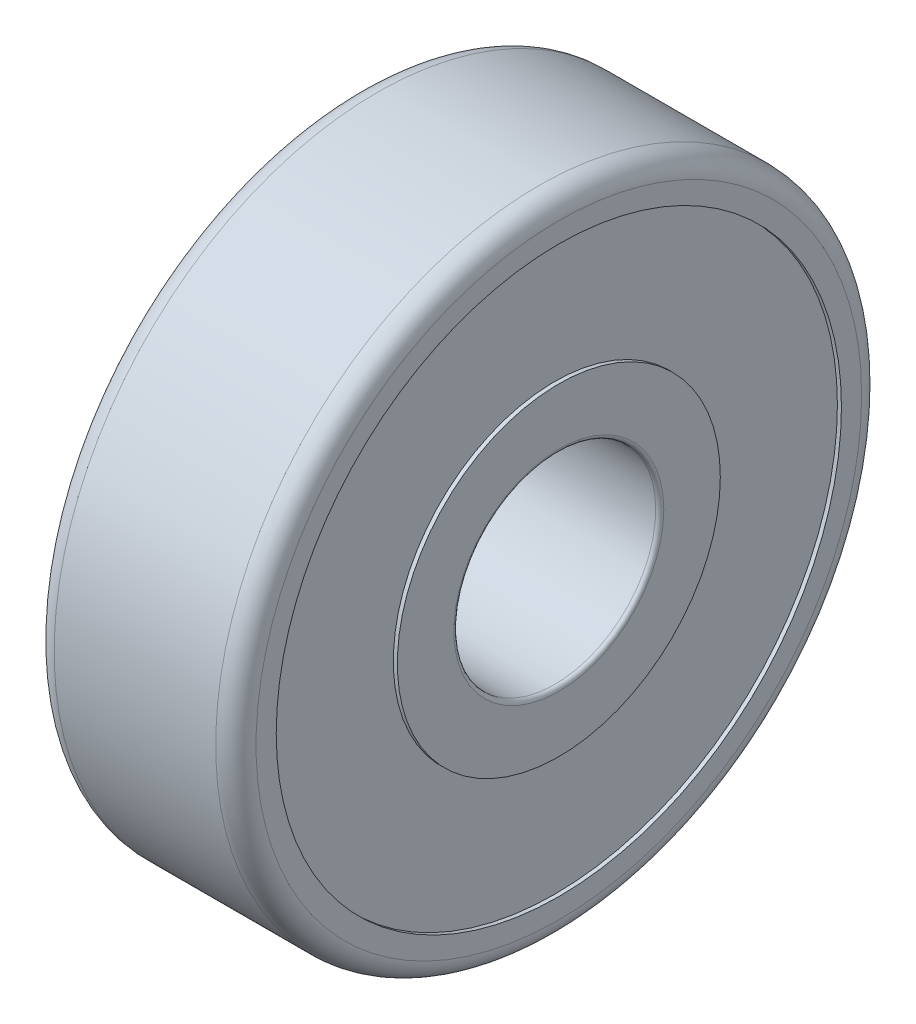
ISO-10303-21;
HEADER;
FILE_DESCRIPTION(('STEP AP214'),'2;1');
FILE_NAME('part.step','',(''),(''),'','','');
FILE_SCHEMA(('AUTOMOTIVE_DESIGN { 1 0 10303 214 1 1 1 1 }'));
ENDSEC;
DATA;
#1=APPLICATION_CONTEXT('core data for automotive mechanical design processes');
#2=APPLICATION_PROTOCOL_DEFINITION('international standard','automotive_design',2000,#1);
#3=PRODUCT_CONTEXT('',#1,'mechanical');
#4=PRODUCT('Part','Part','',(#3));
#5=PRODUCT_RELATED_PRODUCT_CATEGORY('part','',(#4));
#6=PRODUCT_DEFINITION_FORMATION('','',#4);
#7=PRODUCT_DEFINITION_CONTEXT('part definition',#1,'design');
#8=PRODUCT_DEFINITION('design','',#6,#7);
#9=PRODUCT_DEFINITION_SHAPE('','',#8);
#10=(LENGTH_UNIT() NAMED_UNIT(*) SI_UNIT(.MILLI.,.METRE.));
#11=(NAMED_UNIT(*) PLANE_ANGLE_UNIT() SI_UNIT($,.RADIAN.));
#12=(NAMED_UNIT(*) SI_UNIT($,.STERADIAN.) SOLID_ANGLE_UNIT());
#13=UNCERTAINTY_MEASURE_WITH_UNIT(LENGTH_MEASURE(1.E-05),#10,'distance_accuracy_value','');
#14=(GEOMETRIC_REPRESENTATION_CONTEXT(3) GLOBAL_UNCERTAINTY_ASSIGNED_CONTEXT((#13)) GLOBAL_UNIT_ASSIGNED_CONTEXT((#10,
#11,#12)) REPRESENTATION_CONTEXT('',''));
#15=CARTESIAN_POINT('',(0.,0.,0.));
#16=DIRECTION('',(0.,0.,1.));
#17=DIRECTION('',(1.,0.,0.));
#18=AXIS2_PLACEMENT_3D('',#15,#16,#17);
#19=CARTESIAN_POINT('',(2.5,0.,0.));
#20=DIRECTION('',(1.,0.,0.));
#21=DIRECTION('',(0.,0.,-1.));
#22=AXIS2_PLACEMENT_3D('',#19,#20,#21);
#23=PLANE('',#22);
#24=CARTESIAN_POINT('',(2.5,0.,0.));
#25=DIRECTION('',(1.,0.,0.));
#26=DIRECTION('',(0.,0.,-1.));
#27=AXIS2_PLACEMENT_3D('',#24,#25,#26);
#28=CIRCLE('',#27,2.6);
#29=CARTESIAN_POINT('',(2.5,0.,-2.6));
#30=VERTEX_POINT('',#29);
#31=EDGE_CURVE('E10',#30,#30,#28,.F.);
#32=ORIENTED_EDGE('',*,*,#31,.T.);
#33=EDGE_LOOP('',(#32));
#34=FACE_BOUND('',#33,.T.);
#35=CARTESIAN_POINT('',(2.5,0.,0.));
#36=DIRECTION('',(1.,0.,0.));
#37=DIRECTION('',(0.,0.,-1.));
#38=AXIS2_PLACEMENT_3D('',#35,#36,#37);
#39=CIRCLE('',#38,4.);
#40=CARTESIAN_POINT('',(2.5,0.,-4.));
#41=VERTEX_POINT('',#40);
#42=EDGE_CURVE('E85',#41,#41,#39,.T.);
#43=ORIENTED_EDGE('',*,*,#42,.T.);
#44=EDGE_LOOP('',(#43));
#45=FACE_BOUND('',#44,.T.);
#46=ADVANCED_FACE('F34',(#34,#45),#23,.T.);
#47=CARTESIAN_POINT('',(-2.5,0.,0.));
#48=DIRECTION('',(1.,0.,0.));
#49=DIRECTION('',(0.,0.,-1.));
#50=AXIS2_PLACEMENT_3D('',#47,#48,#49);
#51=PLANE('',#50);
#52=CARTESIAN_POINT('',(-2.5,0.,0.));
#53=DIRECTION('',(1.,0.,0.));
#54=DIRECTION('',(0.,0.,-1.));
#55=AXIS2_PLACEMENT_3D('',#52,#53,#54);
#56=CIRCLE('',#55,2.6);
#57=CARTESIAN_POINT('',(-2.5,0.,-2.6));
#58=VERTEX_POINT('',#57);
#59=EDGE_CURVE('E49',#58,#58,#56,.T.);
#60=ORIENTED_EDGE('',*,*,#59,.T.);
#61=EDGE_LOOP('',(#60));
#62=FACE_BOUND('',#61,.T.);
#63=CARTESIAN_POINT('',(-2.5,0.,0.));
#64=DIRECTION('',(-1.,0.,0.));
#65=DIRECTION('',(0.,0.,1.));
#66=AXIS2_PLACEMENT_3D('',#63,#64,#65);
#67=CIRCLE('',#66,4.);
#68=CARTESIAN_POINT('',(-2.5,0.,4.));
#69=VERTEX_POINT('',#68);
#70=EDGE_CURVE('E73',#69,#69,#67,.T.);
#71=ORIENTED_EDGE('',*,*,#70,.T.);
#72=EDGE_LOOP('',(#71));
#73=FACE_BOUND('',#72,.T.);
#74=ADVANCED_FACE('F128',(#62,#73),#51,.F.);
#75=CARTESIAN_POINT('',(-2.5,0.,0.));
#76=DIRECTION('',(1.,0.,0.));
#77=DIRECTION('',(0.,0.,-1.));
#78=AXIS2_PLACEMENT_3D('',#75,#76,#77);
#79=CYLINDRICAL_SURFACE('',#78,8.);
#80=CARTESIAN_POINT('',(2.,0.,0.));
#81=DIRECTION('',(1.,0.,0.));
#82=DIRECTION('',(0.,0.,-1.));
#83=AXIS2_PLACEMENT_3D('',#80,#81,#82);
#84=CIRCLE('',#83,8.);
#85=CARTESIAN_POINT('',(2.,0.,-8.));
#86=VERTEX_POINT('',#85);
#87=EDGE_CURVE('E57',#86,#86,#84,.F.);
#88=ORIENTED_EDGE('',*,*,#87,.T.);
#89=EDGE_LOOP('',(#88));
#90=FACE_BOUND('',#89,.T.);
#91=CARTESIAN_POINT('',(-2.,0.,0.));
#92=DIRECTION('',(1.,0.,0.));
#93=DIRECTION('',(0.,0.,-1.));
#94=AXIS2_PLACEMENT_3D('',#91,#92,#93);
#95=CIRCLE('',#94,8.);
#96=CARTESIAN_POINT('',(-2.,0.,-8.));
#97=VERTEX_POINT('',#96);
#98=EDGE_CURVE('E60',#97,#97,#95,.T.);
#99=ORIENTED_EDGE('',*,*,#98,.T.);
#100=EDGE_LOOP('',(#99));
#101=FACE_BOUND('',#100,.T.);
#102=ADVANCED_FACE('F132',(#90,#101),#79,.T.);
#103=CARTESIAN_POINT('',(-2.5,0.,0.));
#104=DIRECTION('',(-1.,0.,0.));
#105=DIRECTION('',(0.,0.,1.));
#106=AXIS2_PLACEMENT_3D('',#103,#104,#105);
#107=CIRCLE('',#106,7.);
#108=CARTESIAN_POINT('',(-2.5,0.,7.));
#109=VERTEX_POINT('',#108);
#110=EDGE_CURVE('E67',#109,#109,#107,.T.);
#111=ORIENTED_EDGE('',*,*,#110,.F.);
#112=EDGE_LOOP('',(#111));
#113=FACE_BOUND('',#112,.T.);
#114=CARTESIAN_POINT('',(-2.5,0.,0.));
#115=DIRECTION('',(1.,0.,0.));
#116=DIRECTION('',(0.,0.,-1.));
#117=AXIS2_PLACEMENT_3D('',#114,#115,#116);
#118=CIRCLE('',#117,7.5);
#119=CARTESIAN_POINT('',(-2.5,0.,-7.5));
#120=VERTEX_POINT('',#119);
#121=EDGE_CURVE('E54',#120,#120,#118,.F.);
#122=ORIENTED_EDGE('',*,*,#121,.T.);
#123=EDGE_LOOP('',(#122));
#124=FACE_BOUND('',#123,.T.);
#125=ADVANCED_FACE('F135',(#113,#124),#51,.F.);
#126=CARTESIAN_POINT('',(-2.5,0.,0.));
#127=DIRECTION('',(1.,0.,0.));
#128=DIRECTION('',(0.,0.,-1.));
#129=AXIS2_PLACEMENT_3D('',#126,#127,#128);
#130=CYLINDRICAL_SURFACE('',#129,2.5);
#131=CARTESIAN_POINT('',(-2.4,0.,0.));
#132=DIRECTION('',(1.,0.,0.));
#133=DIRECTION('',(0.,0.,-1.));
#134=AXIS2_PLACEMENT_3D('',#131,#132,#133);
#135=CIRCLE('',#134,2.5);
#136=CARTESIAN_POINT('',(-2.4,0.,-2.5));
#137=VERTEX_POINT('',#136);
#138=EDGE_CURVE('E41',#137,#137,#135,.F.);
#139=ORIENTED_EDGE('',*,*,#138,.T.);
#140=EDGE_LOOP('',(#139));
#141=FACE_BOUND('',#140,.T.);
#142=CARTESIAN_POINT('',(2.4,0.,0.));
#143=DIRECTION('',(1.,0.,0.));
#144=DIRECTION('',(0.,0.,-1.));
#145=AXIS2_PLACEMENT_3D('',#142,#143,#144);
#146=CIRCLE('',#145,2.5);
#147=CARTESIAN_POINT('',(2.4,0.,-2.5));
#148=VERTEX_POINT('',#147);
#149=EDGE_CURVE('E45',#148,#148,#146,.T.);
#150=ORIENTED_EDGE('',*,*,#149,.T.);
#151=EDGE_LOOP('',(#150));
#152=FACE_BOUND('',#151,.T.);
#153=ADVANCED_FACE('F111',(#141,#152),#130,.F.);
#154=CARTESIAN_POINT('',(2.5,0.,0.));
#155=DIRECTION('',(1.,0.,0.));
#156=DIRECTION('',(0.,0.,-1.));
#157=AXIS2_PLACEMENT_3D('',#154,#155,#156);
#158=CIRCLE('',#157,7.);
#159=CARTESIAN_POINT('',(2.5,0.,-7.));
#160=VERTEX_POINT('',#159);
#161=EDGE_CURVE('E79',#160,#160,#158,.T.);
#162=ORIENTED_EDGE('',*,*,#161,.F.);
#163=EDGE_LOOP('',(#162));
#164=FACE_BOUND('',#163,.T.);
#165=CARTESIAN_POINT('',(2.5,0.,0.));
#166=DIRECTION('',(1.,0.,0.));
#167=DIRECTION('',(0.,0.,-1.));
#168=AXIS2_PLACEMENT_3D('',#165,#166,#167);
#169=CIRCLE('',#168,7.5);
#170=CARTESIAN_POINT('',(2.5,0.,-7.5));
#171=VERTEX_POINT('',#170);
#172=EDGE_CURVE('E63',#171,#171,#169,.T.);
#173=ORIENTED_EDGE('',*,*,#172,.T.);
#174=EDGE_LOOP('',(#173));
#175=FACE_BOUND('',#174,.T.);
#176=ADVANCED_FACE('F107',(#164,#175),#23,.T.);
#177=CARTESIAN_POINT('',(2.,0.,0.));
#178=DIRECTION('',(1.,0.,0.));
#179=DIRECTION('',(0.,0.,-1.));
#180=AXIS2_PLACEMENT_3D('',#177,#178,#179);
#181=TOROIDAL_SURFACE('',#180,7.5,0.5);
#182=ORIENTED_EDGE('',*,*,#87,.F.);
#183=EDGE_LOOP('',(#182));
#184=FACE_BOUND('',#183,.T.);
#185=ORIENTED_EDGE('',*,*,#172,.F.);
#186=EDGE_LOOP('',(#185));
#187=FACE_BOUND('',#186,.T.);
#188=ADVANCED_FACE('F110',(#184,#187),#181,.T.);
#189=CARTESIAN_POINT('',(-2.,0.,0.));
#190=DIRECTION('',(1.,0.,0.));
#191=DIRECTION('',(0.,0.,-1.));
#192=AXIS2_PLACEMENT_3D('',#189,#190,#191);
#193=TOROIDAL_SURFACE('',#192,7.5,0.5);
#194=ORIENTED_EDGE('',*,*,#121,.F.);
#195=EDGE_LOOP('',(#194));
#196=FACE_BOUND('',#195,.T.);
#197=ORIENTED_EDGE('',*,*,#98,.F.);
#198=EDGE_LOOP('',(#197));
#199=FACE_BOUND('',#198,.T.);
#200=ADVANCED_FACE('F116',(#196,#199),#193,.T.);
#201=CARTESIAN_POINT('',(-2.4,0.,0.));
#202=DIRECTION('',(1.,0.,0.));
#203=DIRECTION('',(0.,0.,-1.));
#204=AXIS2_PLACEMENT_3D('',#201,#202,#203);
#205=TOROIDAL_SURFACE('',#204,2.6,0.1);
#206=ORIENTED_EDGE('',*,*,#138,.F.);
#207=EDGE_LOOP('',(#206));
#208=FACE_BOUND('',#207,.T.);
#209=ORIENTED_EDGE('',*,*,#59,.F.);
#210=EDGE_LOOP('',(#209));
#211=FACE_BOUND('',#210,.T.);
#212=ADVANCED_FACE('F122',(#208,#211),#205,.T.);
#213=CARTESIAN_POINT('',(2.4,0.,0.));
#214=DIRECTION('',(1.,0.,0.));
#215=DIRECTION('',(0.,0.,-1.));
#216=AXIS2_PLACEMENT_3D('',#213,#214,#215);
#217=TOROIDAL_SURFACE('',#216,2.6,0.1);
#218=ORIENTED_EDGE('',*,*,#31,.F.);
#219=EDGE_LOOP('',(#218));
#220=FACE_BOUND('',#219,.T.);
#221=ORIENTED_EDGE('',*,*,#149,.F.);
#222=EDGE_LOOP('',(#221));
#223=FACE_BOUND('',#222,.T.);
#224=ADVANCED_FACE('F36',(#220,#223),#217,.T.);
#225=CARTESIAN_POINT('',(-2.4,0.,0.));
#226=DIRECTION('',(-1.,0.,0.));
#227=DIRECTION('',(0.,0.,1.));
#228=AXIS2_PLACEMENT_3D('',#225,#226,#227);
#229=CYLINDRICAL_SURFACE('',#228,7.);
#230=CARTESIAN_POINT('',(-2.4,0.,0.));
#231=DIRECTION('',(-1.,0.,0.));
#232=DIRECTION('',(0.,0.,1.));
#233=AXIS2_PLACEMENT_3D('',#230,#231,#232);
#234=CIRCLE('',#233,7.);
#235=CARTESIAN_POINT('',(-2.4,0.,7.));
#236=VERTEX_POINT('',#235);
#237=EDGE_CURVE('E66',#236,#236,#234,.T.);
#238=ORIENTED_EDGE('',*,*,#237,.F.);
#239=EDGE_LOOP('',(#238));
#240=FACE_BOUND('',#239,.T.);
#241=ORIENTED_EDGE('',*,*,#110,.T.);
#242=EDGE_LOOP('',(#241));
#243=FACE_BOUND('',#242,.T.);
#244=ADVANCED_FACE('F139',(#240,#243),#229,.F.);
#245=CARTESIAN_POINT('',(-2.4,0.,0.));
#246=DIRECTION('',(-1.,0.,0.));
#247=DIRECTION('',(0.,0.,1.));
#248=AXIS2_PLACEMENT_3D('',#245,#246,#247);
#249=PLANE('',#248);
#250=CARTESIAN_POINT('',(-2.4,0.,0.));
#251=DIRECTION('',(-1.,0.,0.));
#252=DIRECTION('',(0.,0.,1.));
#253=AXIS2_PLACEMENT_3D('',#250,#251,#252);
#254=CIRCLE('',#253,4.);
#255=CARTESIAN_POINT('',(-2.4,0.,4.));
#256=VERTEX_POINT('',#255);
#257=EDGE_CURVE('E70',#256,#256,#254,.T.);
#258=ORIENTED_EDGE('',*,*,#257,.F.);
#259=EDGE_LOOP('',(#258));
#260=FACE_BOUND('',#259,.T.);
#261=ORIENTED_EDGE('',*,*,#237,.T.);
#262=EDGE_LOOP('',(#261));
#263=FACE_BOUND('',#262,.T.);
#264=ADVANCED_FACE('F201',(#260,#263),#249,.T.);
#265=CARTESIAN_POINT('',(-2.4,0.,0.));
#266=DIRECTION('',(-1.,0.,0.));
#267=DIRECTION('',(0.,0.,1.));
#268=AXIS2_PLACEMENT_3D('',#265,#266,#267);
#269=CYLINDRICAL_SURFACE('',#268,4.);
#270=ORIENTED_EDGE('',*,*,#257,.T.);
#271=EDGE_LOOP('',(#270));
#272=FACE_BOUND('',#271,.T.);
#273=ORIENTED_EDGE('',*,*,#70,.F.);
#274=EDGE_LOOP('',(#273));
#275=FACE_BOUND('',#274,.T.);
#276=ADVANCED_FACE('F103',(#272,#275),#269,.T.);
#277=CARTESIAN_POINT('',(2.4,0.,0.));
#278=DIRECTION('',(1.,0.,0.));
#279=DIRECTION('',(0.,0.,-1.));
#280=AXIS2_PLACEMENT_3D('',#277,#278,#279);
#281=CYLINDRICAL_SURFACE('',#280,7.);
#282=CARTESIAN_POINT('',(2.4,0.,0.));
#283=DIRECTION('',(1.,0.,0.));
#284=DIRECTION('',(0.,0.,-1.));
#285=AXIS2_PLACEMENT_3D('',#282,#283,#284);
#286=CIRCLE('',#285,7.);
#287=CARTESIAN_POINT('',(2.4,0.,-7.));
#288=VERTEX_POINT('',#287);
#289=EDGE_CURVE('E76',#288,#288,#286,.T.);
#290=ORIENTED_EDGE('',*,*,#289,.F.);
#291=EDGE_LOOP('',(#290));
#292=FACE_BOUND('',#291,.T.);
#293=ORIENTED_EDGE('',*,*,#161,.T.);
#294=EDGE_LOOP('',(#293));
#295=FACE_BOUND('',#294,.T.);
#296=ADVANCED_FACE('F97',(#292,#295),#281,.F.);
#297=CARTESIAN_POINT('',(2.4,0.,0.));
#298=DIRECTION('',(1.,0.,0.));
#299=DIRECTION('',(0.,0.,-1.));
#300=AXIS2_PLACEMENT_3D('',#297,#298,#299);
#301=PLANE('',#300);
#302=CARTESIAN_POINT('',(2.4,0.,0.));
#303=DIRECTION('',(1.,0.,0.));
#304=DIRECTION('',(0.,0.,-1.));
#305=AXIS2_PLACEMENT_3D('',#302,#303,#304);
#306=CIRCLE('',#305,4.);
#307=CARTESIAN_POINT('',(2.4,0.,-4.));
#308=VERTEX_POINT('',#307);
#309=EDGE_CURVE('E82',#308,#308,#306,.T.);
#310=ORIENTED_EDGE('',*,*,#309,.F.);
#311=EDGE_LOOP('',(#310));
#312=FACE_BOUND('',#311,.T.);
#313=ORIENTED_EDGE('',*,*,#289,.T.);
#314=EDGE_LOOP('',(#313));
#315=FACE_BOUND('',#314,.T.);
#316=ADVANCED_FACE('F94',(#312,#315),#301,.T.);
#317=CARTESIAN_POINT('',(2.4,0.,0.));
#318=DIRECTION('',(1.,0.,0.));
#319=DIRECTION('',(0.,0.,-1.));
#320=AXIS2_PLACEMENT_3D('',#317,#318,#319);
#321=CYLINDRICAL_SURFACE('',#320,4.);
#322=ORIENTED_EDGE('',*,*,#309,.T.);
#323=EDGE_LOOP('',(#322));
#324=FACE_BOUND('',#323,.T.);
#325=ORIENTED_EDGE('',*,*,#42,.F.);
#326=EDGE_LOOP('',(#325));
#327=FACE_BOUND('',#326,.T.);
#328=ADVANCED_FACE('F91',(#324,#327),#321,.T.);
#329=CLOSED_SHELL('',(#46,#74,#102,#125,#153,#176,#188,#200,#212,#224,#244,#264,#276,#296,#316,#328));
#330=MANIFOLD_SOLID_BREP('B2',#329);
#331=ADVANCED_BREP_SHAPE_REPRESENTATION('',(#18,#330),#14);
#332=SHAPE_DEFINITION_REPRESENTATION(#9,#331);
ENDSEC;
END-ISO-10303-21;
